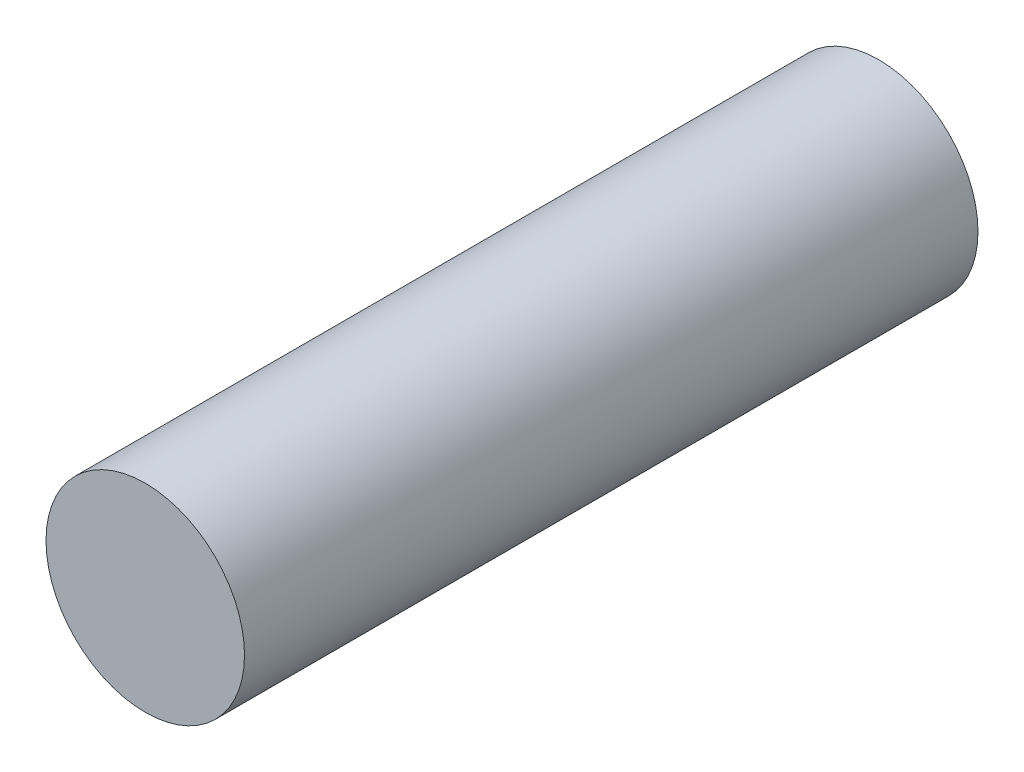
ISO-10303-21;
HEADER;
FILE_DESCRIPTION(('STEP AP214'),'2;1');
FILE_NAME('part.step','',(''),(''),'','','');
FILE_SCHEMA(('AUTOMOTIVE_DESIGN { 1 0 10303 214 1 1 1 1 }'));
ENDSEC;
DATA;
#1=APPLICATION_CONTEXT('core data for automotive mechanical design processes');
#2=APPLICATION_PROTOCOL_DEFINITION('international standard','automotive_design',2000,#1);
#3=PRODUCT_CONTEXT('',#1,'mechanical');
#4=PRODUCT('Part','Part','',(#3));
#5=PRODUCT_RELATED_PRODUCT_CATEGORY('part','',(#4));
#6=PRODUCT_DEFINITION_FORMATION('','',#4);
#7=PRODUCT_DEFINITION_CONTEXT('part definition',#1,'design');
#8=PRODUCT_DEFINITION('design','',#6,#7);
#9=PRODUCT_DEFINITION_SHAPE('','',#8);
#10=(LENGTH_UNIT() NAMED_UNIT(*) SI_UNIT(.MILLI.,.METRE.));
#11=(NAMED_UNIT(*) PLANE_ANGLE_UNIT() SI_UNIT($,.RADIAN.));
#12=(NAMED_UNIT(*) SI_UNIT($,.STERADIAN.) SOLID_ANGLE_UNIT());
#13=UNCERTAINTY_MEASURE_WITH_UNIT(LENGTH_MEASURE(1.E-05),#10,'distance_accuracy_value','');
#14=(GEOMETRIC_REPRESENTATION_CONTEXT(3) GLOBAL_UNCERTAINTY_ASSIGNED_CONTEXT((#13)) GLOBAL_UNIT_ASSIGNED_CONTEXT((#10,
#11,#12)) REPRESENTATION_CONTEXT('',''));
#15=CARTESIAN_POINT('',(0.,0.,0.));
#16=DIRECTION('',(0.,0.,1.));
#17=DIRECTION('',(1.,0.,0.));
#18=AXIS2_PLACEMENT_3D('',#15,#16,#17);
#19=CARTESIAN_POINT('',(0.,0.,14.78));
#20=DIRECTION('',(0.,0.,-1.));
#21=DIRECTION('',(-1.,0.,0.));
#22=AXIS2_PLACEMENT_3D('',#19,#20,#21);
#23=CYLINDRICAL_SURFACE('',#22,2.);
#24=CARTESIAN_POINT('',(0.,0.,14.78));
#25=DIRECTION('',(0.,0.,1.));
#26=DIRECTION('',(1.,0.,0.));
#27=AXIS2_PLACEMENT_3D('',#24,#25,#26);
#28=CIRCLE('',#27,2.);
#29=CARTESIAN_POINT('',(-2.,0.,14.78));
#30=VERTEX_POINT('',#29);
#31=EDGE_CURVE('E10',#30,#30,#28,.T.);
#32=CARTESIAN_POINT('',(0.,0.,0.));
#33=DIRECTION('',(0.,0.,1.));
#34=DIRECTION('',(1.,0.,0.));
#35=AXIS2_PLACEMENT_3D('',#32,#33,#34);
#36=CIRCLE('',#35,2.);
#37=CARTESIAN_POINT('',(-2.,0.,0.));
#38=VERTEX_POINT('',#37);
#39=EDGE_CURVE('E33',#38,#38,#36,.T.);
#40=CARTESIAN_POINT('',(-2.,0.,14.78));
#41=CARTESIAN_POINT('',(-2.,0.,14.6260416666667));
#42=CARTESIAN_POINT('',(-2.,0.,14.4720833333333));
#43=CARTESIAN_POINT('',(-2.,0.,14.1641666666667));
#44=CARTESIAN_POINT('',(-2.,0.,14.0102083333333));
#45=CARTESIAN_POINT('',(-2.,0.,13.7022916666667));
#46=CARTESIAN_POINT('',(-2.,0.,13.5483333333333));
#47=CARTESIAN_POINT('',(-2.,0.,13.2404166666667));
#48=CARTESIAN_POINT('',(-2.,0.,13.0864583333333));
#49=CARTESIAN_POINT('',(-2.,0.,12.7785416666667));
#50=CARTESIAN_POINT('',(-2.,0.,12.6245833333333));
#51=CARTESIAN_POINT('',(-2.,0.,12.3166666666667));
#52=CARTESIAN_POINT('',(-2.,0.,12.1627083333333));
#53=CARTESIAN_POINT('',(-2.,0.,11.8547916666667));
#54=CARTESIAN_POINT('',(-2.,0.,11.7008333333333));
#55=CARTESIAN_POINT('',(-2.,0.,11.3929166666667));
#56=CARTESIAN_POINT('',(-2.,0.,11.2389583333333));
#57=CARTESIAN_POINT('',(-2.,0.,10.9310416666667));
#58=CARTESIAN_POINT('',(-2.,0.,10.7770833333333));
#59=CARTESIAN_POINT('',(-2.,0.,10.4691666666667));
#60=CARTESIAN_POINT('',(-2.,0.,10.3152083333333));
#61=CARTESIAN_POINT('',(-2.,0.,10.0072916666667));
#62=CARTESIAN_POINT('',(-2.,0.,9.85333333333333));
#63=CARTESIAN_POINT('',(-2.,0.,9.54541666666667));
#64=CARTESIAN_POINT('',(-2.,0.,9.39145833333333));
#65=CARTESIAN_POINT('',(-2.,0.,9.08354166666667));
#66=CARTESIAN_POINT('',(-2.,0.,8.92958333333333));
#67=CARTESIAN_POINT('',(-2.,0.,8.62166666666666));
#68=CARTESIAN_POINT('',(-2.,0.,8.46770833333333));
#69=CARTESIAN_POINT('',(-2.,0.,8.15979166666667));
#70=CARTESIAN_POINT('',(-2.,0.,8.00583333333333));
#71=CARTESIAN_POINT('',(-2.,0.,7.69791666666667));
#72=CARTESIAN_POINT('',(-2.,0.,7.54395833333333));
#73=CARTESIAN_POINT('',(-2.,0.,7.23604166666667));
#74=CARTESIAN_POINT('',(-2.,0.,7.08208333333333));
#75=CARTESIAN_POINT('',(-2.,0.,6.77416666666667));
#76=CARTESIAN_POINT('',(-2.,0.,6.62020833333333));
#77=CARTESIAN_POINT('',(-2.,0.,6.31229166666667));
#78=CARTESIAN_POINT('',(-2.,0.,6.15833333333333));
#79=CARTESIAN_POINT('',(-2.,0.,5.85041666666667));
#80=CARTESIAN_POINT('',(-2.,0.,5.69645833333333));
#81=CARTESIAN_POINT('',(-2.,0.,5.38854166666667));
#82=CARTESIAN_POINT('',(-2.,0.,5.23458333333333));
#83=CARTESIAN_POINT('',(-2.,0.,4.92666666666667));
#84=CARTESIAN_POINT('',(-2.,0.,4.77270833333333));
#85=CARTESIAN_POINT('',(-2.,0.,4.46479166666667));
#86=CARTESIAN_POINT('',(-2.,0.,4.31083333333333));
#87=CARTESIAN_POINT('',(-2.,0.,4.00291666666667));
#88=CARTESIAN_POINT('',(-2.,0.,3.84895833333333));
#89=CARTESIAN_POINT('',(-2.,0.,3.54104166666667));
#90=CARTESIAN_POINT('',(-2.,0.,3.38708333333333));
#91=CARTESIAN_POINT('',(-2.,0.,3.07916666666667));
#92=CARTESIAN_POINT('',(-2.,0.,2.92520833333333));
#93=CARTESIAN_POINT('',(-2.,0.,2.61729166666667));
#94=CARTESIAN_POINT('',(-2.,0.,2.46333333333333));
#95=CARTESIAN_POINT('',(-2.,0.,2.15541666666667));
#96=CARTESIAN_POINT('',(-2.,0.,2.00145833333333));
#97=CARTESIAN_POINT('',(-2.,0.,1.69354166666667));
#98=CARTESIAN_POINT('',(-2.,0.,1.53958333333333));
#99=CARTESIAN_POINT('',(-2.,0.,1.23166666666667));
#100=CARTESIAN_POINT('',(-2.,0.,1.07770833333333));
#101=CARTESIAN_POINT('',(-2.,0.,0.769791666666667));
#102=CARTESIAN_POINT('',(-2.,0.,0.615833333333334));
#103=CARTESIAN_POINT('',(-2.,0.,0.307916666666667));
#104=CARTESIAN_POINT('',(-2.,0.,0.153958333333333));
#105=CARTESIAN_POINT('',(-2.,0.,0.));
#106=B_SPLINE_CURVE_WITH_KNOTS('',3,(#40,#41,#42,#43,#44,#45,#46,#47,#48,#49,#50,#51,#52,#53,
#54,#55,#56,#57,#58,#59,#60,#61,#62,#63,#64,#65,#66,#67,#68,#69,#70,#71,#72,#73,#74,#75,#76,#77,
#78,#79,#80,#81,#82,#83,#84,#85,#86,#87,#88,#89,#90,#91,#92,#93,#94,#95,#96,#97,#98,#99,#100,
#101,#102,#103,#104,#105),.UNSPECIFIED.,.F.,.F.,(4,2,2,2,2,2,2,2,2,2,2,2,2,2,2,2,2,2,2,2,2,2,2,
2,2,2,2,2,2,2,2,2,4),(0.,0.461875,0.923750000000001,1.385625,1.8475,2.309375,2.77125,3.233125,
3.695,4.156875,4.61875,5.080625,5.5425,6.004375,6.46625,6.928125,7.39,7.851875,8.31375,8.775625,
9.2375,9.699375,10.16125,10.623125,11.085,11.546875,12.00875,12.470625,12.9325,13.394375,
13.85625,14.318125,14.78),.UNSPECIFIED.);
#107=EDGE_CURVE('BSEAM30',#30,#38,#106,.T.);
#108=ORIENTED_EDGE('',*,*,#31,.F.);
#109=ORIENTED_EDGE('',*,*,#39,.T.);
#110=ORIENTED_EDGE('',*,*,#107,.T.);
#111=ORIENTED_EDGE('',*,*,#107,.F.);
#112=EDGE_LOOP('',(#108,#110,#109,#111));
#113=FACE_BOUND('',#112,.T.);
#114=ADVANCED_FACE('F30',(#113),#23,.T.);
#115=CARTESIAN_POINT('',(0.,0.,14.78));
#116=DIRECTION('',(0.,0.,1.));
#117=DIRECTION('',(1.,0.,0.));
#118=AXIS2_PLACEMENT_3D('',#115,#116,#117);
#119=PLANE('',#118);
#120=ORIENTED_EDGE('',*,*,#31,.T.);
#121=EDGE_LOOP('',(#120));
#122=FACE_BOUND('',#121,.T.);
#123=ADVANCED_FACE('F45',(#122),#119,.T.);
#124=CARTESIAN_POINT('',(0.,0.,0.));
#125=DIRECTION('',(0.,0.,1.));
#126=DIRECTION('',(1.,0.,0.));
#127=AXIS2_PLACEMENT_3D('',#124,#125,#126);
#128=PLANE('',#127);
#129=ORIENTED_EDGE('',*,*,#39,.F.);
#130=EDGE_LOOP('',(#129));
#131=FACE_BOUND('',#130,.T.);
#132=ADVANCED_FACE('F43',(#131),#128,.F.);
#133=CLOSED_SHELL('',(#114,#123,#132));
#134=MANIFOLD_SOLID_BREP('B2',#133);
#135=ADVANCED_BREP_SHAPE_REPRESENTATION('',(#18,#134),#14);
#136=SHAPE_DEFINITION_REPRESENTATION(#9,#135);
ENDSEC;
END-ISO-10303-21;
